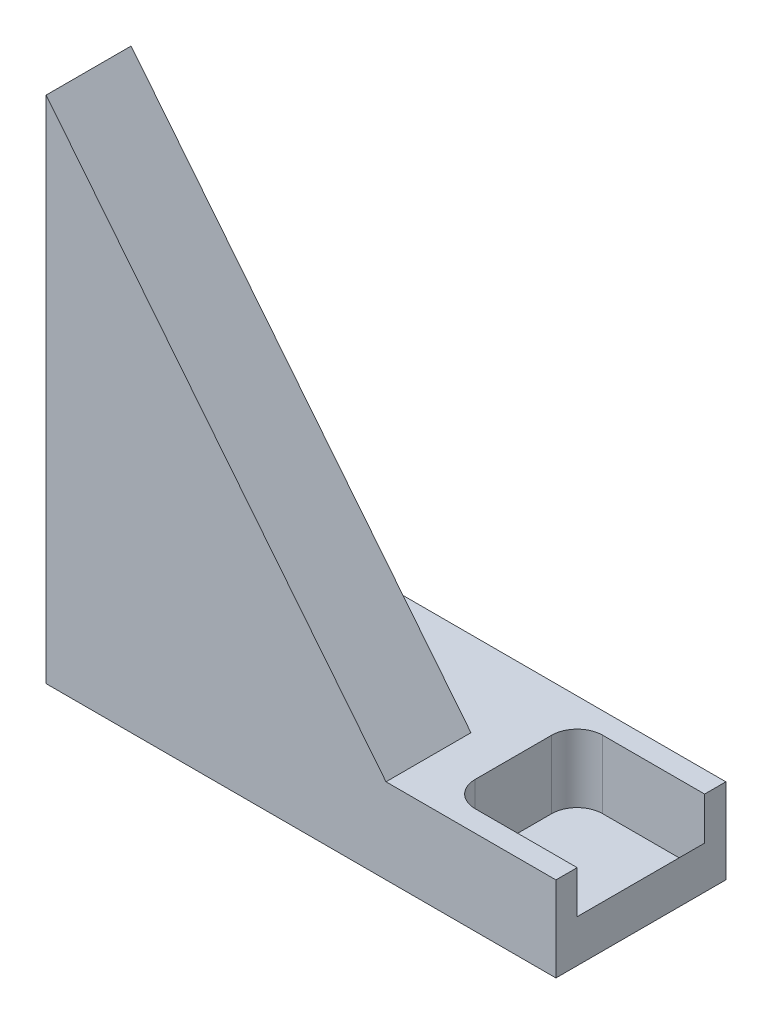
ISO-10303-21;
HEADER;
FILE_DESCRIPTION(('STEP AP214'),'2;1');
FILE_NAME('part.step','',(''),(''),'','','');
FILE_SCHEMA(('AUTOMOTIVE_DESIGN { 1 0 10303 214 1 1 1 1 }'));
ENDSEC;
DATA;
#1=APPLICATION_CONTEXT('core data for automotive mechanical design processes');
#2=APPLICATION_PROTOCOL_DEFINITION('international standard','automotive_design',2000,#1);
#3=PRODUCT_CONTEXT('',#1,'mechanical');
#4=PRODUCT('Part','Part','',(#3));
#5=PRODUCT_RELATED_PRODUCT_CATEGORY('part','',(#4));
#6=PRODUCT_DEFINITION_FORMATION('','',#4);
#7=PRODUCT_DEFINITION_CONTEXT('part definition',#1,'design');
#8=PRODUCT_DEFINITION('design','',#6,#7);
#9=PRODUCT_DEFINITION_SHAPE('','',#8);
#10=(LENGTH_UNIT() NAMED_UNIT(*) SI_UNIT(.MILLI.,.METRE.));
#11=(NAMED_UNIT(*) PLANE_ANGLE_UNIT() SI_UNIT($,.RADIAN.));
#12=(NAMED_UNIT(*) SI_UNIT($,.STERADIAN.) SOLID_ANGLE_UNIT());
#13=UNCERTAINTY_MEASURE_WITH_UNIT(LENGTH_MEASURE(1.E-05),#10,'distance_accuracy_value','');
#14=(GEOMETRIC_REPRESENTATION_CONTEXT(3) GLOBAL_UNCERTAINTY_ASSIGNED_CONTEXT((#13)) GLOBAL_UNIT_ASSIGNED_CONTEXT((#10,
#11,#12)) REPRESENTATION_CONTEXT('',''));
#15=CARTESIAN_POINT('',(0.,0.,0.));
#16=DIRECTION('',(0.,0.,1.));
#17=DIRECTION('',(1.,0.,0.));
#18=AXIS2_PLACEMENT_3D('',#15,#16,#17);
#19=CARTESIAN_POINT('',(0.,0.,0.));
#20=DIRECTION('',(0.,0.,1.));
#21=DIRECTION('',(1.,0.,0.));
#22=AXIS2_PLACEMENT_3D('',#19,#20,#21);
#23=PLANE('',#22);
#24=DIRECTION('',(1.,0.,0.));
#25=VECTOR('',#24,1.);
#26=CARTESIAN_POINT('',(60.,10.,0.));
#27=LINE('',#26,#25);
#28=CARTESIAN_POINT('',(0.,10.,0.));
#29=VERTEX_POINT('',#28);
#30=CARTESIAN_POINT('',(40.,9.99999999999999,0.));
#31=VERTEX_POINT('',#30);
#32=EDGE_CURVE('E215',#29,#31,#27,.T.);
#33=ORIENTED_EDGE('',*,*,#32,.F.);
#34=DIRECTION('',(0.,-1.,0.));
#35=VECTOR('',#34,1.);
#36=CARTESIAN_POINT('',(0.,60.,0.));
#37=LINE('',#36,#35);
#38=CARTESIAN_POINT('',(0.,60.,0.));
#39=VERTEX_POINT('',#38);
#40=EDGE_CURVE('E176',#39,#29,#37,.T.);
#41=ORIENTED_EDGE('',*,*,#40,.F.);
#42=DIRECTION('',(-0.624695047554424,0.78086880944303,0.));
#43=VECTOR('',#42,1.);
#44=CARTESIAN_POINT('',(40.,9.99999999999999,0.));
#45=LINE('',#44,#43);
#46=EDGE_CURVE('E235',#31,#39,#45,.T.);
#47=ORIENTED_EDGE('',*,*,#46,.F.);
#48=EDGE_LOOP('',(#33,#41,#47));
#49=FACE_BOUND('',#48,.T.);
#50=ADVANCED_FACE('F39',(#49),#23,.F.);
#51=CARTESIAN_POINT('',(60.,10.,10.));
#52=DIRECTION('',(0.,-1.,0.));
#53=DIRECTION('',(1.,0.,0.));
#54=AXIS2_PLACEMENT_3D('',#51,#52,#53);
#55=PLANE('',#54);
#56=DIRECTION('',(0.,0.,-1.));
#57=VECTOR('',#56,1.);
#58=CARTESIAN_POINT('',(60.,10.,10.));
#59=LINE('',#58,#57);
#60=CARTESIAN_POINT('',(60.,10.,10.));
#61=VERTEX_POINT('',#60);
#62=CARTESIAN_POINT('',(60.,10.,7.5));
#63=VERTEX_POINT('',#62);
#64=EDGE_CURVE('E168',#61,#63,#59,.T.);
#65=ORIENTED_EDGE('',*,*,#64,.T.);
#66=DIRECTION('',(-1.,0.,0.));
#67=VECTOR('',#66,1.);
#68=CARTESIAN_POINT('',(60.,10.,7.5));
#69=LINE('',#68,#67);
#70=CARTESIAN_POINT('',(48.,10.,7.5));
#71=VERTEX_POINT('',#70);
#72=EDGE_CURVE('E415',#63,#71,#69,.T.);
#73=ORIENTED_EDGE('',*,*,#72,.T.);
#74=CARTESIAN_POINT('',(48.,10.,4.5));
#75=DIRECTION('',(0.,-1.,0.));
#76=DIRECTION('',(1.,0.,0.));
#77=AXIS2_PLACEMENT_3D('',#74,#75,#76);
#78=CIRCLE('',#77,3.);
#79=CARTESIAN_POINT('',(45.,10.,4.5));
#80=VERTEX_POINT('',#79);
#81=EDGE_CURVE('E11',#71,#80,#78,.T.);
#82=ORIENTED_EDGE('',*,*,#81,.T.);
#83=DIRECTION('',(0.,0.,-1.));
#84=VECTOR('',#83,1.);
#85=CARTESIAN_POINT('',(45.,10.,7.5));
#86=LINE('',#85,#84);
#87=CARTESIAN_POINT('',(45.,10.,-4.5));
#88=VERTEX_POINT('',#87);
#89=EDGE_CURVE('E207',#80,#88,#86,.T.);
#90=ORIENTED_EDGE('',*,*,#89,.T.);
#91=CARTESIAN_POINT('',(48.,10.,-4.5));
#92=DIRECTION('',(0.,-1.,0.));
#93=DIRECTION('',(1.,0.,0.));
#94=AXIS2_PLACEMENT_3D('',#91,#92,#93);
#95=CIRCLE('',#94,3.);
#96=CARTESIAN_POINT('',(48.,10.,-7.5));
#97=VERTEX_POINT('',#96);
#98=EDGE_CURVE('E47',#88,#97,#95,.T.);
#99=ORIENTED_EDGE('',*,*,#98,.T.);
#100=DIRECTION('',(-1.,0.,0.));
#101=VECTOR('',#100,1.);
#102=CARTESIAN_POINT('',(60.,10.,-7.5));
#103=LINE('',#102,#101);
#104=CARTESIAN_POINT('',(60.,10.,-7.5));
#105=VERTEX_POINT('',#104);
#106=EDGE_CURVE('E146',#105,#97,#103,.T.);
#107=ORIENTED_EDGE('',*,*,#106,.F.);
#108=CARTESIAN_POINT('',(60.,10.,-10.));
#109=VERTEX_POINT('',#108);
#110=EDGE_CURVE('E159',#105,#109,#59,.T.);
#111=ORIENTED_EDGE('',*,*,#110,.T.);
#112=DIRECTION('',(1.,0.,0.));
#113=VECTOR('',#112,1.);
#114=CARTESIAN_POINT('',(60.,10.,-10.));
#115=LINE('',#114,#113);
#116=CARTESIAN_POINT('',(0.,10.,-10.));
#117=VERTEX_POINT('',#116);
#118=EDGE_CURVE('E229',#117,#109,#115,.T.);
#119=ORIENTED_EDGE('',*,*,#118,.F.);
#120=DIRECTION('',(0.,0.,1.));
#121=VECTOR('',#120,1.);
#122=CARTESIAN_POINT('',(0.,10.,-10.));
#123=LINE('',#122,#121);
#124=EDGE_CURVE('E232',#117,#29,#123,.T.);
#125=ORIENTED_EDGE('',*,*,#124,.T.);
#126=ORIENTED_EDGE('',*,*,#32,.T.);
#127=DIRECTION('',(0.,0.,-1.));
#128=VECTOR('',#127,1.);
#129=CARTESIAN_POINT('',(40.,9.99999999999999,10.));
#130=LINE('',#129,#128);
#131=CARTESIAN_POINT('',(40.,9.99999999999999,10.));
#132=VERTEX_POINT('',#131);
#133=EDGE_CURVE('E184',#132,#31,#130,.T.);
#134=ORIENTED_EDGE('',*,*,#133,.F.);
#135=DIRECTION('',(-1.,0.,0.));
#136=VECTOR('',#135,1.);
#137=CARTESIAN_POINT('',(60.,10.,10.));
#138=LINE('',#137,#136);
#139=EDGE_CURVE('E236',#61,#132,#138,.T.);
#140=ORIENTED_EDGE('',*,*,#139,.F.);
#141=EDGE_LOOP('',(#65,#73,#82,#90,#99,#107,#111,#119,#125,#126,#134,#140));
#142=FACE_BOUND('',#141,.T.);
#143=ADVANCED_FACE('F157',(#142),#55,.F.);
#144=CARTESIAN_POINT('',(40.,9.99999999999999,10.));
#145=DIRECTION('',(-0.78086880944303,-0.624695047554424,0.));
#146=DIRECTION('',(0.624695047554424,-0.78086880944303,0.));
#147=AXIS2_PLACEMENT_3D('',#144,#145,#146);
#148=PLANE('',#147);
#149=ORIENTED_EDGE('',*,*,#46,.T.);
#150=DIRECTION('',(0.,0.,-1.));
#151=VECTOR('',#150,1.);
#152=CARTESIAN_POINT('',(0.,60.,10.));
#153=LINE('',#152,#151);
#154=CARTESIAN_POINT('',(0.,60.,10.));
#155=VERTEX_POINT('',#154);
#156=EDGE_CURVE('E181',#155,#39,#153,.T.);
#157=ORIENTED_EDGE('',*,*,#156,.F.);
#158=DIRECTION('',(-0.624695047554424,0.78086880944303,0.));
#159=VECTOR('',#158,1.);
#160=CARTESIAN_POINT('',(40.,9.99999999999999,10.));
#161=LINE('',#160,#159);
#162=EDGE_CURVE('E239',#132,#155,#161,.T.);
#163=ORIENTED_EDGE('',*,*,#162,.F.);
#164=ORIENTED_EDGE('',*,*,#133,.T.);
#165=EDGE_LOOP('',(#149,#157,#163,#164));
#166=FACE_BOUND('',#165,.T.);
#167=ADVANCED_FACE('F269',(#166),#148,.F.);
#168=CARTESIAN_POINT('',(0.,60.,10.));
#169=DIRECTION('',(1.,0.,0.));
#170=DIRECTION('',(0.,1.,0.));
#171=AXIS2_PLACEMENT_3D('',#168,#169,#170);
#172=PLANE('',#171);
#173=ORIENTED_EDGE('',*,*,#40,.T.);
#174=ORIENTED_EDGE('',*,*,#124,.F.);
#175=DIRECTION('',(0.,1.,0.));
#176=VECTOR('',#175,1.);
#177=CARTESIAN_POINT('',(0.,0.,-10.));
#178=LINE('',#177,#176);
#179=CARTESIAN_POINT('',(0.,0.,-10.));
#180=VERTEX_POINT('',#179);
#181=EDGE_CURVE('E227',#180,#117,#178,.T.);
#182=ORIENTED_EDGE('',*,*,#181,.F.);
#183=DIRECTION('',(0.,0.,-1.));
#184=VECTOR('',#183,1.);
#185=CARTESIAN_POINT('',(0.,0.,10.));
#186=LINE('',#185,#184);
#187=CARTESIAN_POINT('',(0.,0.,10.));
#188=VERTEX_POINT('',#187);
#189=EDGE_CURVE('E179',#188,#180,#186,.T.);
#190=ORIENTED_EDGE('',*,*,#189,.F.);
#191=DIRECTION('',(0.,-1.,0.));
#192=VECTOR('',#191,1.);
#193=CARTESIAN_POINT('',(0.,60.,10.));
#194=LINE('',#193,#192);
#195=EDGE_CURVE('E241',#155,#188,#194,.T.);
#196=ORIENTED_EDGE('',*,*,#195,.F.);
#197=ORIENTED_EDGE('',*,*,#156,.T.);
#198=EDGE_LOOP('',(#173,#174,#182,#190,#196,#197));
#199=FACE_BOUND('',#198,.T.);
#200=ADVANCED_FACE('F250',(#199),#172,.F.);
#201=CARTESIAN_POINT('',(0.,0.,10.));
#202=DIRECTION('',(0.,1.,0.));
#203=DIRECTION('',(0.,0.,1.));
#204=AXIS2_PLACEMENT_3D('',#201,#202,#203);
#205=PLANE('',#204);
#206=ORIENTED_EDGE('',*,*,#189,.T.);
#207=DIRECTION('',(-1.,0.,0.));
#208=VECTOR('',#207,1.);
#209=CARTESIAN_POINT('',(60.,0.,-10.));
#210=LINE('',#209,#208);
#211=CARTESIAN_POINT('',(60.,0.,-10.));
#212=VERTEX_POINT('',#211);
#213=EDGE_CURVE('E223',#212,#180,#210,.T.);
#214=ORIENTED_EDGE('',*,*,#213,.F.);
#215=DIRECTION('',(0.,0.,-1.));
#216=VECTOR('',#215,1.);
#217=CARTESIAN_POINT('',(60.,0.,10.));
#218=LINE('',#217,#216);
#219=CARTESIAN_POINT('',(60.,0.,10.));
#220=VERTEX_POINT('',#219);
#221=EDGE_CURVE('E171',#220,#212,#218,.T.);
#222=ORIENTED_EDGE('',*,*,#221,.F.);
#223=DIRECTION('',(1.,0.,0.));
#224=VECTOR('',#223,1.);
#225=CARTESIAN_POINT('',(0.,0.,10.));
#226=LINE('',#225,#224);
#227=EDGE_CURVE('E172',#188,#220,#226,.T.);
#228=ORIENTED_EDGE('',*,*,#227,.F.);
#229=EDGE_LOOP('',(#206,#214,#222,#228));
#230=FACE_BOUND('',#229,.T.);
#231=ADVANCED_FACE('F264',(#230),#205,.F.);
#232=CARTESIAN_POINT('',(60.,0.,10.));
#233=DIRECTION('',(-1.,0.,0.));
#234=DIRECTION('',(0.,0.,1.));
#235=AXIS2_PLACEMENT_3D('',#232,#233,#234);
#236=PLANE('',#235);
#237=DIRECTION('',(0.,0.,-1.));
#238=VECTOR('',#237,1.);
#239=CARTESIAN_POINT('',(60.,5.,7.5));
#240=LINE('',#239,#238);
#241=CARTESIAN_POINT('',(60.,5.,7.5));
#242=VERTEX_POINT('',#241);
#243=CARTESIAN_POINT('',(60.,5.,-7.5));
#244=VERTEX_POINT('',#243);
#245=EDGE_CURVE('E218',#242,#244,#240,.T.);
#246=ORIENTED_EDGE('',*,*,#245,.F.);
#247=DIRECTION('',(0.,1.,0.));
#248=VECTOR('',#247,1.);
#249=CARTESIAN_POINT('',(60.,5.,7.5));
#250=LINE('',#249,#248);
#251=EDGE_CURVE('E418',#242,#63,#250,.T.);
#252=ORIENTED_EDGE('',*,*,#251,.T.);
#253=ORIENTED_EDGE('',*,*,#64,.F.);
#254=DIRECTION('',(0.,1.,0.));
#255=VECTOR('',#254,1.);
#256=CARTESIAN_POINT('',(60.,0.,10.));
#257=LINE('',#256,#255);
#258=EDGE_CURVE('E169',#220,#61,#257,.T.);
#259=ORIENTED_EDGE('',*,*,#258,.F.);
#260=ORIENTED_EDGE('',*,*,#221,.T.);
#261=DIRECTION('',(0.,-1.,0.));
#262=VECTOR('',#261,1.);
#263=CARTESIAN_POINT('',(60.,0.,-10.));
#264=LINE('',#263,#262);
#265=EDGE_CURVE('E167',#109,#212,#264,.T.);
#266=ORIENTED_EDGE('',*,*,#265,.F.);
#267=ORIENTED_EDGE('',*,*,#110,.F.);
#268=DIRECTION('',(0.,1.,0.));
#269=VECTOR('',#268,1.);
#270=CARTESIAN_POINT('',(60.,5.,-7.5));
#271=LINE('',#270,#269);
#272=EDGE_CURVE('E142',#244,#105,#271,.T.);
#273=ORIENTED_EDGE('',*,*,#272,.F.);
#274=EDGE_LOOP('',(#246,#252,#253,#259,#260,#266,#267,#273));
#275=FACE_BOUND('',#274,.T.);
#276=ADVANCED_FACE('F165',(#275),#236,.F.);
#277=CARTESIAN_POINT('',(0.,0.,10.));
#278=DIRECTION('',(0.,0.,1.));
#279=DIRECTION('',(1.,0.,0.));
#280=AXIS2_PLACEMENT_3D('',#277,#278,#279);
#281=PLANE('',#280);
#282=ORIENTED_EDGE('',*,*,#139,.T.);
#283=ORIENTED_EDGE('',*,*,#162,.T.);
#284=ORIENTED_EDGE('',*,*,#195,.T.);
#285=ORIENTED_EDGE('',*,*,#227,.T.);
#286=ORIENTED_EDGE('',*,*,#258,.T.);
#287=EDGE_LOOP('',(#282,#283,#284,#285,#286));
#288=FACE_BOUND('',#287,.T.);
#289=ADVANCED_FACE('F267',(#288),#281,.T.);
#290=CARTESIAN_POINT('',(0.,0.,-10.));
#291=DIRECTION('',(0.,0.,1.));
#292=DIRECTION('',(1.,0.,0.));
#293=AXIS2_PLACEMENT_3D('',#290,#291,#292);
#294=PLANE('',#293);
#295=ORIENTED_EDGE('',*,*,#265,.T.);
#296=ORIENTED_EDGE('',*,*,#213,.T.);
#297=ORIENTED_EDGE('',*,*,#181,.T.);
#298=ORIENTED_EDGE('',*,*,#118,.T.);
#299=EDGE_LOOP('',(#295,#296,#297,#298));
#300=FACE_BOUND('',#299,.T.);
#301=ADVANCED_FACE('F258',(#300),#294,.F.);
#302=CARTESIAN_POINT('',(45.,10.,7.5));
#303=DIRECTION('',(1.,0.,0.));
#304=DIRECTION('',(0.,0.,-1.));
#305=AXIS2_PLACEMENT_3D('',#302,#303,#304);
#306=PLANE('',#305);
#307=DIRECTION('',(0.,0.,-1.));
#308=VECTOR('',#307,1.);
#309=CARTESIAN_POINT('',(45.,2.,7.5));
#310=LINE('',#309,#308);
#311=CARTESIAN_POINT('',(45.,2.,4.5));
#312=VERTEX_POINT('',#311);
#313=CARTESIAN_POINT('',(45.,2.,-4.5));
#314=VERTEX_POINT('',#313);
#315=EDGE_CURVE('E206',#312,#314,#310,.T.);
#316=ORIENTED_EDGE('',*,*,#315,.T.);
#317=DIRECTION('',(0.,-1.,0.));
#318=VECTOR('',#317,1.);
#319=CARTESIAN_POINT('',(45.,10.,-4.5));
#320=LINE('',#319,#318);
#321=EDGE_CURVE('E62',#314,#88,#320,.F.);
#322=ORIENTED_EDGE('',*,*,#321,.T.);
#323=ORIENTED_EDGE('',*,*,#89,.F.);
#324=DIRECTION('',(0.,-1.,0.));
#325=VECTOR('',#324,1.);
#326=CARTESIAN_POINT('',(45.,10.,4.5));
#327=LINE('',#326,#325);
#328=EDGE_CURVE('E199',#80,#312,#327,.T.);
#329=ORIENTED_EDGE('',*,*,#328,.T.);
#330=EDGE_LOOP('',(#316,#322,#323,#329));
#331=FACE_BOUND('',#330,.T.);
#332=ADVANCED_FACE('F205',(#331),#306,.T.);
#333=CARTESIAN_POINT('',(45.,2.,7.5));
#334=DIRECTION('',(0.,1.,0.));
#335=DIRECTION('',(0.,0.,1.));
#336=AXIS2_PLACEMENT_3D('',#333,#334,#335);
#337=PLANE('',#336);
#338=DIRECTION('',(1.,0.,0.));
#339=VECTOR('',#338,1.);
#340=CARTESIAN_POINT('',(45.,2.,-7.5));
#341=LINE('',#340,#339);
#342=CARTESIAN_POINT('',(48.,2.,-7.5));
#343=VERTEX_POINT('',#342);
#344=CARTESIAN_POINT('',(58.,2.,-7.5));
#345=VERTEX_POINT('',#344);
#346=EDGE_CURVE('E162',#343,#345,#341,.T.);
#347=ORIENTED_EDGE('',*,*,#346,.F.);
#348=CARTESIAN_POINT('',(48.,2.,-4.5));
#349=DIRECTION('',(0.,1.,0.));
#350=DIRECTION('',(0.,0.,1.));
#351=AXIS2_PLACEMENT_3D('',#348,#349,#350);
#352=CIRCLE('',#351,3.);
#353=EDGE_CURVE('E197',#343,#314,#352,.T.);
#354=ORIENTED_EDGE('',*,*,#353,.T.);
#355=ORIENTED_EDGE('',*,*,#315,.F.);
#356=CARTESIAN_POINT('',(48.,2.,4.5));
#357=DIRECTION('',(0.,1.,0.));
#358=DIRECTION('',(0.,0.,1.));
#359=AXIS2_PLACEMENT_3D('',#356,#357,#358);
#360=CIRCLE('',#359,3.);
#361=CARTESIAN_POINT('',(48.,2.,7.5));
#362=VERTEX_POINT('',#361);
#363=EDGE_CURVE('E195',#312,#362,#360,.T.);
#364=ORIENTED_EDGE('',*,*,#363,.T.);
#365=DIRECTION('',(1.,0.,0.));
#366=VECTOR('',#365,1.);
#367=CARTESIAN_POINT('',(45.,2.,7.5));
#368=LINE('',#367,#366);
#369=CARTESIAN_POINT('',(58.,2.,7.5));
#370=VERTEX_POINT('',#369);
#371=EDGE_CURVE('E417',#362,#370,#368,.T.);
#372=ORIENTED_EDGE('',*,*,#371,.T.);
#373=DIRECTION('',(0.,0.,-1.));
#374=VECTOR('',#373,1.);
#375=CARTESIAN_POINT('',(58.,2.,7.5));
#376=LINE('',#375,#374);
#377=EDGE_CURVE('E213',#370,#345,#376,.T.);
#378=ORIENTED_EDGE('',*,*,#377,.T.);
#379=EDGE_LOOP('',(#347,#354,#355,#364,#372,#378));
#380=FACE_BOUND('',#379,.T.);
#381=ADVANCED_FACE('F212',(#380),#337,.T.);
#382=CARTESIAN_POINT('',(58.,2.,7.5));
#383=DIRECTION('',(-1.,0.,0.));
#384=DIRECTION('',(0.,0.,1.));
#385=AXIS2_PLACEMENT_3D('',#382,#383,#384);
#386=PLANE('',#385);
#387=DIRECTION('',(0.,1.,0.));
#388=VECTOR('',#387,1.);
#389=CARTESIAN_POINT('',(58.,2.,7.5));
#390=LINE('',#389,#388);
#391=CARTESIAN_POINT('',(58.,3.00000000000001,7.5));
#392=VERTEX_POINT('',#391);
#393=EDGE_CURVE('E420',#370,#392,#390,.T.);
#394=ORIENTED_EDGE('',*,*,#393,.T.);
#395=DIRECTION('',(0.,0.,-1.));
#396=VECTOR('',#395,1.);
#397=CARTESIAN_POINT('',(58.,3.00000000000001,7.5));
#398=LINE('',#397,#396);
#399=CARTESIAN_POINT('',(58.,3.00000000000001,-7.5));
#400=VERTEX_POINT('',#399);
#401=EDGE_CURVE('E187',#392,#400,#398,.T.);
#402=ORIENTED_EDGE('',*,*,#401,.T.);
#403=DIRECTION('',(0.,1.,0.));
#404=VECTOR('',#403,1.);
#405=CARTESIAN_POINT('',(58.,2.,-7.5));
#406=LINE('',#405,#404);
#407=EDGE_CURVE('E422',#345,#400,#406,.T.);
#408=ORIENTED_EDGE('',*,*,#407,.F.);
#409=ORIENTED_EDGE('',*,*,#377,.F.);
#410=EDGE_LOOP('',(#394,#402,#408,#409));
#411=FACE_BOUND('',#410,.T.);
#412=ADVANCED_FACE('F316',(#411),#386,.T.);
#413=CARTESIAN_POINT('',(0.,0.,7.5));
#414=DIRECTION('',(0.,0.,1.));
#415=DIRECTION('',(1.,0.,0.));
#416=AXIS2_PLACEMENT_3D('',#413,#414,#415);
#417=PLANE('',#416);
#418=ORIENTED_EDGE('',*,*,#371,.F.);
#419=DIRECTION('',(0.,-1.,0.));
#420=VECTOR('',#419,1.);
#421=CARTESIAN_POINT('',(48.,0.,7.5));
#422=LINE('',#421,#420);
#423=EDGE_CURVE('E54',#362,#71,#422,.F.);
#424=ORIENTED_EDGE('',*,*,#423,.T.);
#425=ORIENTED_EDGE('',*,*,#72,.F.);
#426=ORIENTED_EDGE('',*,*,#251,.F.);
#427=DIRECTION('',(0.70710678118655,0.707106781186545,0.));
#428=VECTOR('',#427,1.);
#429=CARTESIAN_POINT('',(27.4999999999998,-27.5,7.5));
#430=LINE('',#429,#428);
#431=EDGE_CURVE('E191',#242,#392,#430,.F.);
#432=ORIENTED_EDGE('',*,*,#431,.T.);
#433=ORIENTED_EDGE('',*,*,#393,.F.);
#434=EDGE_LOOP('',(#418,#424,#425,#426,#432,#433));
#435=FACE_BOUND('',#434,.T.);
#436=ADVANCED_FACE('F323',(#435),#417,.F.);
#437=CARTESIAN_POINT('',(0.,0.,-7.5));
#438=DIRECTION('',(0.,0.,1.));
#439=DIRECTION('',(1.,0.,0.));
#440=AXIS2_PLACEMENT_3D('',#437,#438,#439);
#441=PLANE('',#440);
#442=ORIENTED_EDGE('',*,*,#106,.T.);
#443=DIRECTION('',(0.,-1.,0.));
#444=VECTOR('',#443,1.);
#445=CARTESIAN_POINT('',(48.,2.,-7.5));
#446=LINE('',#445,#444);
#447=EDGE_CURVE('E193',#97,#343,#446,.T.);
#448=ORIENTED_EDGE('',*,*,#447,.T.);
#449=ORIENTED_EDGE('',*,*,#346,.T.);
#450=ORIENTED_EDGE('',*,*,#407,.T.);
#451=DIRECTION('',(-0.70710678118655,-0.707106781186545,0.));
#452=VECTOR('',#451,1.);
#453=CARTESIAN_POINT('',(58.,3.00000000000001,-7.5));
#454=LINE('',#453,#452);
#455=EDGE_CURVE('E149',#400,#244,#454,.F.);
#456=ORIENTED_EDGE('',*,*,#455,.T.);
#457=ORIENTED_EDGE('',*,*,#272,.T.);
#458=EDGE_LOOP('',(#442,#448,#449,#450,#456,#457));
#459=FACE_BOUND('',#458,.T.);
#460=ADVANCED_FACE('F144',(#459),#441,.T.);
#461=CARTESIAN_POINT('',(58.,3.00000000000001,7.5));
#462=DIRECTION('',(0.707106781186545,-0.70710678118655,0.));
#463=DIRECTION('',(0.,0.,-1.));
#464=AXIS2_PLACEMENT_3D('',#461,#462,#463);
#465=PLANE('',#464);
#466=ORIENTED_EDGE('',*,*,#431,.F.);
#467=ORIENTED_EDGE('',*,*,#245,.T.);
#468=ORIENTED_EDGE('',*,*,#455,.F.);
#469=ORIENTED_EDGE('',*,*,#401,.F.);
#470=EDGE_LOOP('',(#466,#467,#468,#469));
#471=FACE_BOUND('',#470,.T.);
#472=ADVANCED_FACE('F337',(#471),#465,.F.);
#473=CARTESIAN_POINT('',(48.,0.,-4.5));
#474=DIRECTION('',(0.,1.,0.));
#475=DIRECTION('',(0.,0.,1.));
#476=AXIS2_PLACEMENT_3D('',#473,#474,#475);
#477=CYLINDRICAL_SURFACE('',#476,3.);
#478=ORIENTED_EDGE('',*,*,#98,.F.);
#479=ORIENTED_EDGE('',*,*,#321,.F.);
#480=ORIENTED_EDGE('',*,*,#353,.F.);
#481=ORIENTED_EDGE('',*,*,#447,.F.);
#482=EDGE_LOOP('',(#478,#479,#480,#481));
#483=FACE_BOUND('',#482,.T.);
#484=ADVANCED_FACE('F344',(#483),#477,.F.);
#485=CARTESIAN_POINT('',(48.,10.,4.5));
#486=DIRECTION('',(0.,-1.,0.));
#487=DIRECTION('',(0.,0.,-1.));
#488=AXIS2_PLACEMENT_3D('',#485,#486,#487);
#489=CYLINDRICAL_SURFACE('',#488,3.);
#490=ORIENTED_EDGE('',*,*,#81,.F.);
#491=ORIENTED_EDGE('',*,*,#423,.F.);
#492=ORIENTED_EDGE('',*,*,#363,.F.);
#493=ORIENTED_EDGE('',*,*,#328,.F.);
#494=EDGE_LOOP('',(#490,#491,#492,#493));
#495=FACE_BOUND('',#494,.T.);
#496=ADVANCED_FACE('F41',(#495),#489,.F.);
#497=CLOSED_SHELL('',(#50,#143,#167,#200,#231,#276,#289,#301,#332,#381,#412,#436,#460,#472,#484,#496));
#498=MANIFOLD_SOLID_BREP('B2',#497);
#499=ADVANCED_BREP_SHAPE_REPRESENTATION('',(#18,#498),#14);
#500=SHAPE_DEFINITION_REPRESENTATION(#9,#499);
ENDSEC;
END-ISO-10303-21;
